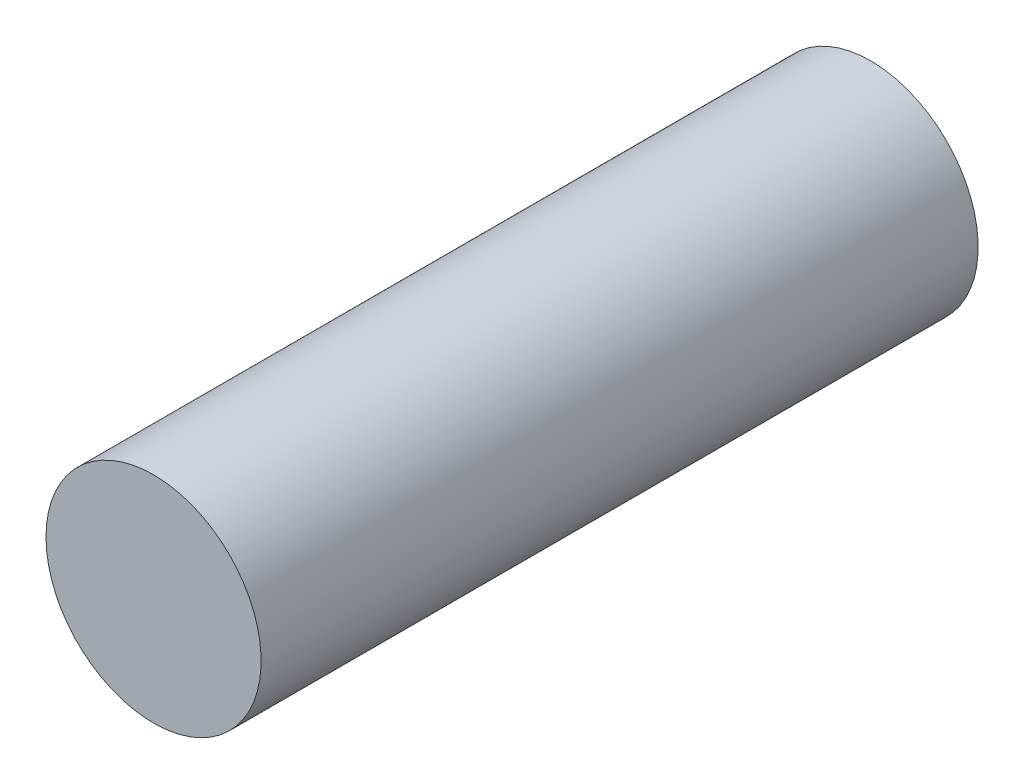
ISO-10303-21;
HEADER;
FILE_DESCRIPTION(('STEP AP214'),'2;1');
FILE_NAME('part.step','',(''),(''),'','','');
FILE_SCHEMA(('AUTOMOTIVE_DESIGN { 1 0 10303 214 1 1 1 1 }'));
ENDSEC;
DATA;
#1=APPLICATION_CONTEXT('core data for automotive mechanical design processes');
#2=APPLICATION_PROTOCOL_DEFINITION('international standard','automotive_design',2000,#1);
#3=PRODUCT_CONTEXT('',#1,'mechanical');
#4=PRODUCT('Part','Part','',(#3));
#5=PRODUCT_RELATED_PRODUCT_CATEGORY('part','',(#4));
#6=PRODUCT_DEFINITION_FORMATION('','',#4);
#7=PRODUCT_DEFINITION_CONTEXT('part definition',#1,'design');
#8=PRODUCT_DEFINITION('design','',#6,#7);
#9=PRODUCT_DEFINITION_SHAPE('','',#8);
#10=(LENGTH_UNIT() NAMED_UNIT(*) SI_UNIT(.MILLI.,.METRE.));
#11=(NAMED_UNIT(*) PLANE_ANGLE_UNIT() SI_UNIT($,.RADIAN.));
#12=(NAMED_UNIT(*) SI_UNIT($,.STERADIAN.) SOLID_ANGLE_UNIT());
#13=UNCERTAINTY_MEASURE_WITH_UNIT(LENGTH_MEASURE(1.E-05),#10,'distance_accuracy_value','');
#14=(GEOMETRIC_REPRESENTATION_CONTEXT(3) GLOBAL_UNCERTAINTY_ASSIGNED_CONTEXT((#13)) GLOBAL_UNIT_ASSIGNED_CONTEXT((#10,
#11,#12)) REPRESENTATION_CONTEXT('',''));
#15=CARTESIAN_POINT('',(0.,0.,0.));
#16=DIRECTION('',(0.,0.,1.));
#17=DIRECTION('',(1.,0.,0.));
#18=AXIS2_PLACEMENT_3D('',#15,#16,#17);
#19=CARTESIAN_POINT('',(0.,0.,15.24));
#20=DIRECTION('',(0.,0.,-1.));
#21=DIRECTION('',(-1.,0.,0.));
#22=AXIS2_PLACEMENT_3D('',#19,#20,#21);
#23=CYLINDRICAL_SURFACE('',#22,2.286);
#24=CARTESIAN_POINT('',(0.,0.,15.24));
#25=DIRECTION('',(0.,0.,1.));
#26=DIRECTION('',(1.,0.,0.));
#27=AXIS2_PLACEMENT_3D('',#24,#25,#26);
#28=CIRCLE('',#27,2.286);
#29=CARTESIAN_POINT('',(-2.286,0.,15.24));
#30=VERTEX_POINT('',#29);
#31=EDGE_CURVE('E10',#30,#30,#28,.T.);
#32=CARTESIAN_POINT('',(0.,0.,0.));
#33=DIRECTION('',(0.,0.,1.));
#34=DIRECTION('',(1.,0.,0.));
#35=AXIS2_PLACEMENT_3D('',#32,#33,#34);
#36=CIRCLE('',#35,2.286);
#37=CARTESIAN_POINT('',(-2.286,0.,0.));
#38=VERTEX_POINT('',#37);
#39=EDGE_CURVE('E40',#38,#38,#36,.T.);
#40=CARTESIAN_POINT('',(-2.286,0.,15.24));
#41=CARTESIAN_POINT('',(-2.286,0.,15.08125));
#42=CARTESIAN_POINT('',(-2.286,0.,14.9225));
#43=CARTESIAN_POINT('',(-2.286,0.,14.605));
#44=CARTESIAN_POINT('',(-2.286,0.,14.44625));
#45=CARTESIAN_POINT('',(-2.286,0.,14.12875));
#46=CARTESIAN_POINT('',(-2.286,0.,13.97));
#47=CARTESIAN_POINT('',(-2.286,0.,13.6525));
#48=CARTESIAN_POINT('',(-2.286,0.,13.49375));
#49=CARTESIAN_POINT('',(-2.286,0.,13.17625));
#50=CARTESIAN_POINT('',(-2.286,0.,13.0175));
#51=CARTESIAN_POINT('',(-2.286,0.,12.7));
#52=CARTESIAN_POINT('',(-2.286,0.,12.54125));
#53=CARTESIAN_POINT('',(-2.286,0.,12.22375));
#54=CARTESIAN_POINT('',(-2.286,0.,12.065));
#55=CARTESIAN_POINT('',(-2.286,0.,11.7475));
#56=CARTESIAN_POINT('',(-2.286,0.,11.58875));
#57=CARTESIAN_POINT('',(-2.286,0.,11.27125));
#58=CARTESIAN_POINT('',(-2.286,0.,11.1125));
#59=CARTESIAN_POINT('',(-2.286,0.,10.795));
#60=CARTESIAN_POINT('',(-2.286,0.,10.63625));
#61=CARTESIAN_POINT('',(-2.286,0.,10.31875));
#62=CARTESIAN_POINT('',(-2.286,0.,10.16));
#63=CARTESIAN_POINT('',(-2.286,0.,9.8425));
#64=CARTESIAN_POINT('',(-2.286,0.,9.68375));
#65=CARTESIAN_POINT('',(-2.286,0.,9.36625));
#66=CARTESIAN_POINT('',(-2.286,0.,9.2075));
#67=CARTESIAN_POINT('',(-2.286,0.,8.89));
#68=CARTESIAN_POINT('',(-2.286,0.,8.73125));
#69=CARTESIAN_POINT('',(-2.286,0.,8.41375));
#70=CARTESIAN_POINT('',(-2.286,0.,8.255));
#71=CARTESIAN_POINT('',(-2.286,0.,7.9375));
#72=CARTESIAN_POINT('',(-2.286,0.,7.77875));
#73=CARTESIAN_POINT('',(-2.286,0.,7.46125));
#74=CARTESIAN_POINT('',(-2.286,0.,7.3025));
#75=CARTESIAN_POINT('',(-2.286,0.,6.985));
#76=CARTESIAN_POINT('',(-2.286,0.,6.82625));
#77=CARTESIAN_POINT('',(-2.286,0.,6.50875));
#78=CARTESIAN_POINT('',(-2.286,0.,6.35));
#79=CARTESIAN_POINT('',(-2.286,0.,6.0325));
#80=CARTESIAN_POINT('',(-2.286,0.,5.87375));
#81=CARTESIAN_POINT('',(-2.286,0.,5.55625));
#82=CARTESIAN_POINT('',(-2.286,0.,5.3975));
#83=CARTESIAN_POINT('',(-2.286,0.,5.08));
#84=CARTESIAN_POINT('',(-2.286,0.,4.92125));
#85=CARTESIAN_POINT('',(-2.286,0.,4.60375));
#86=CARTESIAN_POINT('',(-2.286,0.,4.445));
#87=CARTESIAN_POINT('',(-2.286,0.,4.1275));
#88=CARTESIAN_POINT('',(-2.286,0.,3.96875));
#89=CARTESIAN_POINT('',(-2.286,0.,3.65125));
#90=CARTESIAN_POINT('',(-2.286,0.,3.4925));
#91=CARTESIAN_POINT('',(-2.286,0.,3.175));
#92=CARTESIAN_POINT('',(-2.286,0.,3.01625));
#93=CARTESIAN_POINT('',(-2.286,0.,2.69875));
#94=CARTESIAN_POINT('',(-2.286,0.,2.54));
#95=CARTESIAN_POINT('',(-2.286,0.,2.2225));
#96=CARTESIAN_POINT('',(-2.286,0.,2.06375));
#97=CARTESIAN_POINT('',(-2.286,0.,1.74625));
#98=CARTESIAN_POINT('',(-2.286,0.,1.5875));
#99=CARTESIAN_POINT('',(-2.286,0.,1.27));
#100=CARTESIAN_POINT('',(-2.286,0.,1.11125));
#101=CARTESIAN_POINT('',(-2.286,0.,0.79375));
#102=CARTESIAN_POINT('',(-2.286,0.,0.634999999999999));
#103=CARTESIAN_POINT('',(-2.286,0.,0.3175));
#104=CARTESIAN_POINT('',(-2.286,0.,0.15875));
#105=CARTESIAN_POINT('',(-2.286,0.,0.));
#106=B_SPLINE_CURVE_WITH_KNOTS('',3,(#40,#41,#42,#43,#44,#45,#46,#47,#48,#49,#50,#51,#52,#53,
#54,#55,#56,#57,#58,#59,#60,#61,#62,#63,#64,#65,#66,#67,#68,#69,#70,#71,#72,#73,#74,#75,#76,#77,
#78,#79,#80,#81,#82,#83,#84,#85,#86,#87,#88,#89,#90,#91,#92,#93,#94,#95,#96,#97,#98,#99,#100,
#101,#102,#103,#104,#105),.UNSPECIFIED.,.F.,.F.,(4,2,2,2,2,2,2,2,2,2,2,2,2,2,2,2,2,2,2,2,2,2,2,
2,2,2,2,2,2,2,2,2,4),(0.,0.476249999999999,0.952499999999998,1.42875,1.905,2.38125,2.8575,
3.33375,3.81,4.28625,4.7625,5.23875,5.715,6.19125,6.6675,7.14375,7.62,8.09625,8.5725,9.04875,
9.525,10.00125,10.4775,10.95375,11.43,11.90625,12.3825,12.85875,13.335,13.81125,14.2875,
14.76375,15.24),.UNSPECIFIED.);
#107=EDGE_CURVE('BSEAM37',#30,#38,#106,.T.);
#108=ORIENTED_EDGE('',*,*,#31,.F.);
#109=ORIENTED_EDGE('',*,*,#39,.T.);
#110=ORIENTED_EDGE('',*,*,#107,.T.);
#111=ORIENTED_EDGE('',*,*,#107,.F.);
#112=EDGE_LOOP('',(#108,#110,#109,#111));
#113=FACE_BOUND('',#112,.T.);
#114=ADVANCED_FACE('F37',(#113),#23,.T.);
#115=CARTESIAN_POINT('',(0.,0.,15.24));
#116=DIRECTION('',(0.,0.,1.));
#117=DIRECTION('',(1.,0.,0.));
#118=AXIS2_PLACEMENT_3D('',#115,#116,#117);
#119=PLANE('',#118);
#120=ORIENTED_EDGE('',*,*,#31,.T.);
#121=EDGE_LOOP('',(#120));
#122=FACE_BOUND('',#121,.T.);
#123=ADVANCED_FACE('F52',(#122),#119,.T.);
#124=CARTESIAN_POINT('',(0.,0.,0.));
#125=DIRECTION('',(0.,0.,1.));
#126=DIRECTION('',(1.,0.,0.));
#127=AXIS2_PLACEMENT_3D('',#124,#125,#126);
#128=PLANE('',#127);
#129=ORIENTED_EDGE('',*,*,#39,.F.);
#130=EDGE_LOOP('',(#129));
#131=FACE_BOUND('',#130,.T.);
#132=ADVANCED_FACE('F50',(#131),#128,.F.);
#133=CLOSED_SHELL('',(#114,#123,#132));
#134=MANIFOLD_SOLID_BREP('B2',#133);
#135=ADVANCED_BREP_SHAPE_REPRESENTATION('',(#18,#134),#14);
#136=SHAPE_DEFINITION_REPRESENTATION(#9,#135);
ENDSEC;
END-ISO-10303-21;
